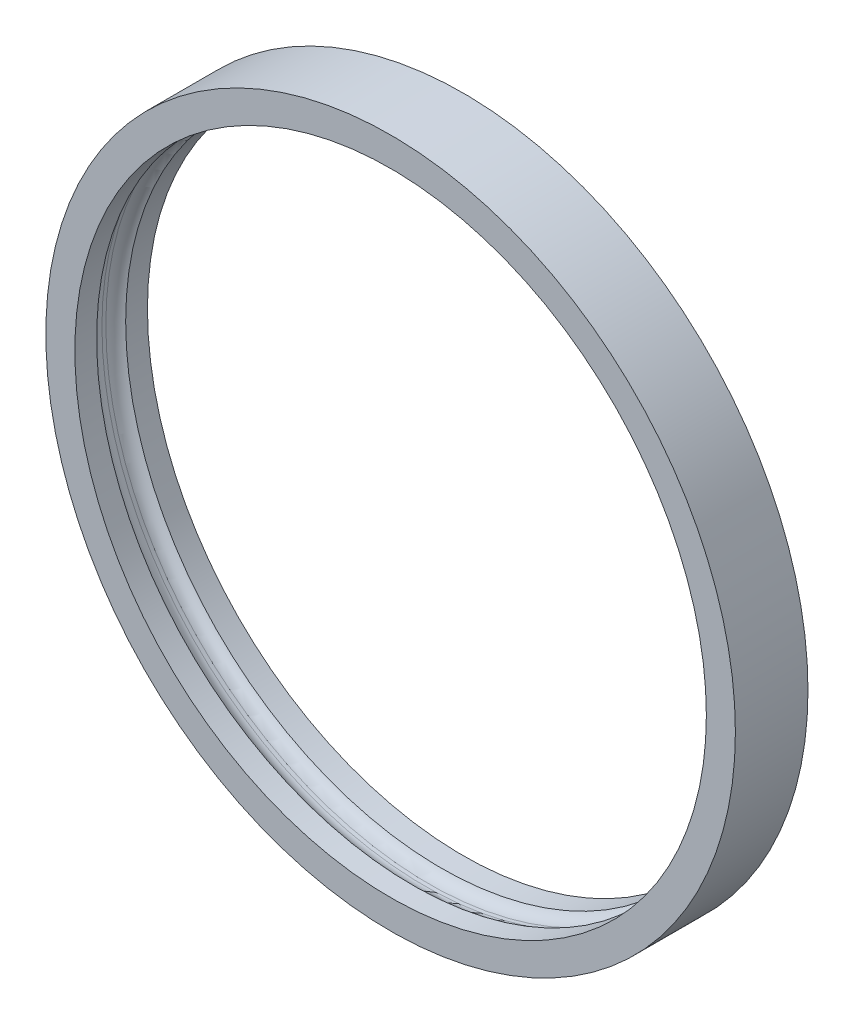
ISO-10303-21;
HEADER;
FILE_DESCRIPTION(('STEP AP214'),'2;1');
FILE_NAME('part.step','',(''),(''),'','','');
FILE_SCHEMA(('AUTOMOTIVE_DESIGN { 1 0 10303 214 1 1 1 1 }'));
ENDSEC;
DATA;
#1=APPLICATION_CONTEXT('core data for automotive mechanical design processes');
#2=APPLICATION_PROTOCOL_DEFINITION('international standard','automotive_design',2000,#1);
#3=PRODUCT_CONTEXT('',#1,'mechanical');
#4=PRODUCT('Part','Part','',(#3));
#5=PRODUCT_RELATED_PRODUCT_CATEGORY('part','',(#4));
#6=PRODUCT_DEFINITION_FORMATION('','',#4);
#7=PRODUCT_DEFINITION_CONTEXT('part definition',#1,'design');
#8=PRODUCT_DEFINITION('design','',#6,#7);
#9=PRODUCT_DEFINITION_SHAPE('','',#8);
#10=(LENGTH_UNIT() NAMED_UNIT(*) SI_UNIT(.MILLI.,.METRE.));
#11=(NAMED_UNIT(*) PLANE_ANGLE_UNIT() SI_UNIT($,.RADIAN.));
#12=(NAMED_UNIT(*) SI_UNIT($,.STERADIAN.) SOLID_ANGLE_UNIT());
#13=UNCERTAINTY_MEASURE_WITH_UNIT(LENGTH_MEASURE(1.E-05),#10,'distance_accuracy_value','');
#14=(GEOMETRIC_REPRESENTATION_CONTEXT(3) GLOBAL_UNCERTAINTY_ASSIGNED_CONTEXT((#13)) GLOBAL_UNIT_ASSIGNED_CONTEXT((#10,
#11,#12)) REPRESENTATION_CONTEXT('',''));
#15=CARTESIAN_POINT('',(0.,0.,0.));
#16=DIRECTION('',(0.,0.,1.));
#17=DIRECTION('',(1.,0.,0.));
#18=AXIS2_PLACEMENT_3D('',#15,#16,#17);
#19=CARTESIAN_POINT('',(0.,0.,10.));
#20=DIRECTION('',(0.,0.,-1.));
#21=DIRECTION('',(-1.,0.,0.));
#22=AXIS2_PLACEMENT_3D('',#19,#20,#21);
#23=CYLINDRICAL_SURFACE('',#22,44.5);
#24=CARTESIAN_POINT('',(0.,0.,4.73205080756888));
#25=DIRECTION('',(0.,0.,-1.));
#26=DIRECTION('',(-1.,0.,0.));
#27=AXIS2_PLACEMENT_3D('',#24,#25,#26);
#28=CIRCLE('',#27,44.5);
#29=CARTESIAN_POINT('',(-44.5,0.,4.73205080756888));
#30=VERTEX_POINT('',#29);
#31=EDGE_CURVE('E10',#30,#30,#28,.T.);
#32=ORIENTED_EDGE('',*,*,#31,.T.);
#33=EDGE_LOOP('',(#32));
#34=FACE_BOUND('',#33,.T.);
#35=CARTESIAN_POINT('',(0.,0.,5.26794919243112));
#36=DIRECTION('',(0.,0.,1.));
#37=DIRECTION('',(1.,0.,0.));
#38=AXIS2_PLACEMENT_3D('',#35,#36,#37);
#39=CIRCLE('',#38,44.5);
#40=CARTESIAN_POINT('',(44.5,0.,5.26794919243112));
#41=VERTEX_POINT('',#40);
#42=EDGE_CURVE('E37',#41,#41,#39,.T.);
#43=ORIENTED_EDGE('',*,*,#42,.T.);
#44=EDGE_LOOP('',(#43));
#45=FACE_BOUND('',#44,.T.);
#46=ADVANCED_FACE('F30',(#34,#45),#23,.F.);
#47=CARTESIAN_POINT('',(0.,0.,10.));
#48=DIRECTION('',(0.,0.,1.));
#49=DIRECTION('',(1.,0.,0.));
#50=AXIS2_PLACEMENT_3D('',#47,#48,#49);
#51=PLANE('',#50);
#52=CARTESIAN_POINT('',(0.,0.,10.));
#53=DIRECTION('',(0.,0.,1.));
#54=DIRECTION('',(1.,0.,0.));
#55=AXIS2_PLACEMENT_3D('',#52,#53,#54);
#56=CIRCLE('',#55,47.5);
#57=CARTESIAN_POINT('',(47.5,0.,10.));
#58=VERTEX_POINT('',#57);
#59=EDGE_CURVE('E41',#58,#58,#56,.T.);
#60=ORIENTED_EDGE('',*,*,#59,.T.);
#61=EDGE_LOOP('',(#60));
#62=FACE_BOUND('',#61,.T.);
#63=CARTESIAN_POINT('',(0.,0.,10.));
#64=DIRECTION('',(0.,0.,1.));
#65=DIRECTION('',(1.,0.,0.));
#66=AXIS2_PLACEMENT_3D('',#63,#64,#65);
#67=CIRCLE('',#66,43.5);
#68=CARTESIAN_POINT('',(43.5,0.,10.));
#69=VERTEX_POINT('',#68);
#70=EDGE_CURVE('E51',#69,#69,#67,.T.);
#71=ORIENTED_EDGE('',*,*,#70,.F.);
#72=EDGE_LOOP('',(#71));
#73=FACE_BOUND('',#72,.T.);
#74=ADVANCED_FACE('F75',(#62,#73),#51,.T.);
#75=CARTESIAN_POINT('',(0.,0.,0.));
#76=DIRECTION('',(0.,0.,1.));
#77=DIRECTION('',(1.,0.,0.));
#78=AXIS2_PLACEMENT_3D('',#75,#76,#77);
#79=PLANE('',#78);
#80=CARTESIAN_POINT('',(0.,0.,0.));
#81=DIRECTION('',(0.,0.,1.));
#82=DIRECTION('',(1.,0.,0.));
#83=AXIS2_PLACEMENT_3D('',#80,#81,#82);
#84=CIRCLE('',#83,47.5);
#85=CARTESIAN_POINT('',(47.5,0.,0.));
#86=VERTEX_POINT('',#85);
#87=EDGE_CURVE('E45',#86,#86,#84,.T.);
#88=ORIENTED_EDGE('',*,*,#87,.F.);
#89=EDGE_LOOP('',(#88));
#90=FACE_BOUND('',#89,.T.);
#91=CARTESIAN_POINT('',(0.,0.,0.));
#92=DIRECTION('',(0.,0.,-1.));
#93=DIRECTION('',(-1.,0.,0.));
#94=AXIS2_PLACEMENT_3D('',#91,#92,#93);
#95=CIRCLE('',#94,43.5);
#96=CARTESIAN_POINT('',(-43.5,0.,0.));
#97=VERTEX_POINT('',#96);
#98=EDGE_CURVE('E57',#97,#97,#95,.T.);
#99=ORIENTED_EDGE('',*,*,#98,.F.);
#100=EDGE_LOOP('',(#99));
#101=FACE_BOUND('',#100,.T.);
#102=ADVANCED_FACE('F72',(#90,#101),#79,.F.);
#103=CARTESIAN_POINT('',(0.,0.,10.));
#104=DIRECTION('',(0.,0.,-1.));
#105=DIRECTION('',(-1.,0.,0.));
#106=AXIS2_PLACEMENT_3D('',#103,#104,#105);
#107=CYLINDRICAL_SURFACE('',#106,47.5);
#108=ORIENTED_EDGE('',*,*,#59,.F.);
#109=EDGE_LOOP('',(#108));
#110=FACE_BOUND('',#109,.T.);
#111=ORIENTED_EDGE('',*,*,#87,.T.);
#112=EDGE_LOOP('',(#111));
#113=FACE_BOUND('',#112,.T.);
#114=ADVANCED_FACE('F74',(#110,#113),#107,.T.);
#115=CARTESIAN_POINT('',(0.,0.,7.));
#116=DIRECTION('',(0.,0.,1.));
#117=DIRECTION('',(1.,0.,0.));
#118=AXIS2_PLACEMENT_3D('',#115,#116,#117);
#119=CYLINDRICAL_SURFACE('',#118,43.5);
#120=CARTESIAN_POINT('',(0.,0.,7.));
#121=DIRECTION('',(0.,0.,1.));
#122=DIRECTION('',(1.,0.,0.));
#123=AXIS2_PLACEMENT_3D('',#120,#121,#122);
#124=CIRCLE('',#123,43.5);
#125=CARTESIAN_POINT('',(43.5,0.,7.));
#126=VERTEX_POINT('',#125);
#127=EDGE_CURVE('E49',#126,#126,#124,.T.);
#128=ORIENTED_EDGE('',*,*,#127,.F.);
#129=EDGE_LOOP('',(#128));
#130=FACE_BOUND('',#129,.T.);
#131=ORIENTED_EDGE('',*,*,#70,.T.);
#132=EDGE_LOOP('',(#131));
#133=FACE_BOUND('',#132,.T.);
#134=ADVANCED_FACE('F82',(#130,#133),#119,.F.);
#135=CARTESIAN_POINT('',(0.,0.,5.26794919243112));
#136=DIRECTION('',(0.,0.,1.));
#137=DIRECTION('',(1.,0.,0.));
#138=AXIS2_PLACEMENT_3D('',#135,#136,#137);
#139=TOROIDAL_SURFACE('',#138,42.5,2.);
#140=ORIENTED_EDGE('',*,*,#127,.T.);
#141=EDGE_LOOP('',(#140));
#142=FACE_BOUND('',#141,.T.);
#143=ORIENTED_EDGE('',*,*,#42,.F.);
#144=EDGE_LOOP('',(#143));
#145=FACE_BOUND('',#144,.T.);
#146=ADVANCED_FACE('F68',(#142,#145),#139,.F.);
#147=CARTESIAN_POINT('',(0.,0.,3.));
#148=DIRECTION('',(0.,0.,-1.));
#149=DIRECTION('',(-1.,0.,0.));
#150=AXIS2_PLACEMENT_3D('',#147,#148,#149);
#151=CYLINDRICAL_SURFACE('',#150,43.5);
#152=CARTESIAN_POINT('',(0.,0.,3.));
#153=DIRECTION('',(0.,0.,-1.));
#154=DIRECTION('',(-1.,0.,0.));
#155=AXIS2_PLACEMENT_3D('',#152,#153,#154);
#156=CIRCLE('',#155,43.5);
#157=CARTESIAN_POINT('',(-43.5,0.,3.));
#158=VERTEX_POINT('',#157);
#159=EDGE_CURVE('E54',#158,#158,#156,.T.);
#160=ORIENTED_EDGE('',*,*,#159,.F.);
#161=EDGE_LOOP('',(#160));
#162=FACE_BOUND('',#161,.T.);
#163=ORIENTED_EDGE('',*,*,#98,.T.);
#164=EDGE_LOOP('',(#163));
#165=FACE_BOUND('',#164,.T.);
#166=ADVANCED_FACE('F65',(#162,#165),#151,.F.);
#167=CARTESIAN_POINT('',(0.,0.,4.73205080756888));
#168=DIRECTION('',(0.,0.,-1.));
#169=DIRECTION('',(-1.,0.,0.));
#170=AXIS2_PLACEMENT_3D('',#167,#168,#169);
#171=TOROIDAL_SURFACE('',#170,42.5,2.);
#172=ORIENTED_EDGE('',*,*,#159,.T.);
#173=EDGE_LOOP('',(#172));
#174=FACE_BOUND('',#173,.T.);
#175=ORIENTED_EDGE('',*,*,#31,.F.);
#176=EDGE_LOOP('',(#175));
#177=FACE_BOUND('',#176,.T.);
#178=ADVANCED_FACE('F32',(#174,#177),#171,.F.);
#179=CLOSED_SHELL('',(#46,#74,#102,#114,#134,#146,#166,#178));
#180=MANIFOLD_SOLID_BREP('B2',#179);
#181=ADVANCED_BREP_SHAPE_REPRESENTATION('',(#18,#180),#14);
#182=SHAPE_DEFINITION_REPRESENTATION(#9,#181);
ENDSEC;
END-ISO-10303-21;
